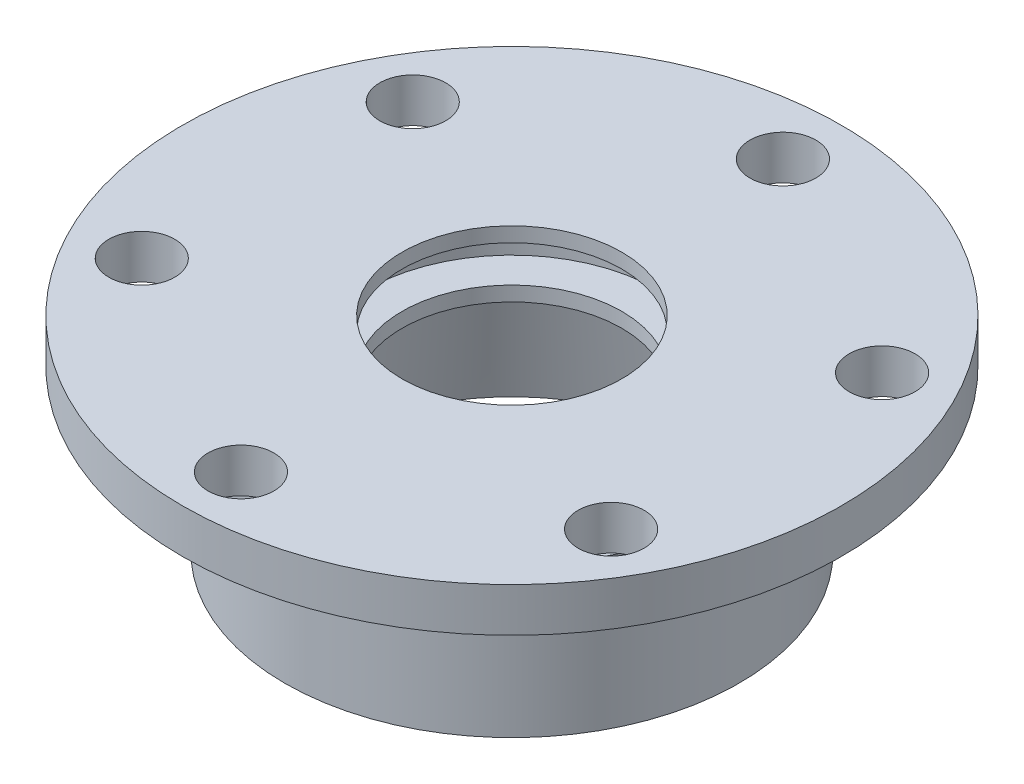
ISO-10303-21;
HEADER;
FILE_DESCRIPTION(('STEP AP214'),'2;1');
FILE_NAME('part.step','',(''),(''),'','','');
FILE_SCHEMA(('AUTOMOTIVE_DESIGN { 1 0 10303 214 1 1 1 1 }'));
ENDSEC;
DATA;
#1=APPLICATION_CONTEXT('core data for automotive mechanical design processes');
#2=APPLICATION_PROTOCOL_DEFINITION('international standard','automotive_design',2000,#1);
#3=PRODUCT_CONTEXT('',#1,'mechanical');
#4=PRODUCT('Part','Part','',(#3));
#5=PRODUCT_RELATED_PRODUCT_CATEGORY('part','',(#4));
#6=PRODUCT_DEFINITION_FORMATION('','',#4);
#7=PRODUCT_DEFINITION_CONTEXT('part definition',#1,'design');
#8=PRODUCT_DEFINITION('design','',#6,#7);
#9=PRODUCT_DEFINITION_SHAPE('','',#8);
#10=(LENGTH_UNIT() NAMED_UNIT(*) SI_UNIT(.MILLI.,.METRE.));
#11=(NAMED_UNIT(*) PLANE_ANGLE_UNIT() SI_UNIT($,.RADIAN.));
#12=(NAMED_UNIT(*) SI_UNIT($,.STERADIAN.) SOLID_ANGLE_UNIT());
#13=UNCERTAINTY_MEASURE_WITH_UNIT(LENGTH_MEASURE(1.E-05),#10,'distance_accuracy_value','');
#14=(GEOMETRIC_REPRESENTATION_CONTEXT(3) GLOBAL_UNCERTAINTY_ASSIGNED_CONTEXT((#13)) GLOBAL_UNIT_ASSIGNED_CONTEXT((#10,
#11,#12)) REPRESENTATION_CONTEXT('',''));
#15=CARTESIAN_POINT('',(0.,0.,0.));
#16=DIRECTION('',(0.,0.,1.));
#17=DIRECTION('',(1.,0.,0.));
#18=AXIS2_PLACEMENT_3D('',#15,#16,#17);
#19=CARTESIAN_POINT('',(-29.,28.,0.));
#20=DIRECTION('',(0.,1.,0.));
#21=DIRECTION('',(0.,0.,1.));
#22=AXIS2_PLACEMENT_3D('',#19,#20,#21);
#23=PLANE('',#22);
#24=CARTESIAN_POINT('',(0.,28.,-37.));
#25=DIRECTION('',(0.,1.,0.));
#26=DIRECTION('',(0.,0.,1.));
#27=AXIS2_PLACEMENT_3D('',#24,#25,#26);
#28=CIRCLE('',#27,4.5);
#29=CARTESIAN_POINT('',(0.,28.,-32.5));
#30=VERTEX_POINT('',#29);
#31=EDGE_CURVE('E79',#30,#30,#28,.T.);
#32=ORIENTED_EDGE('',*,*,#31,.F.);
#33=EDGE_LOOP('',(#32));
#34=FACE_BOUND('',#33,.T.);
#35=CARTESIAN_POINT('',(-32.0429399400232,28.,-18.4999999999982));
#36=DIRECTION('',(0.,1.,0.));
#37=DIRECTION('',(0.,0.,1.));
#38=AXIS2_PLACEMENT_3D('',#35,#36,#37);
#39=CIRCLE('',#38,4.50000000000197);
#40=CARTESIAN_POINT('',(-32.0429399400232,28.,-13.9999999999962));
#41=VERTEX_POINT('',#40);
#42=EDGE_CURVE('E84',#41,#41,#39,.T.);
#43=ORIENTED_EDGE('',*,*,#42,.F.);
#44=EDGE_LOOP('',(#43));
#45=FACE_BOUND('',#44,.T.);
#46=CARTESIAN_POINT('',(-32.0429399400211,28.,18.5000000000018));
#47=DIRECTION('',(0.,1.,0.));
#48=DIRECTION('',(0.,0.,1.));
#49=AXIS2_PLACEMENT_3D('',#46,#47,#48);
#50=CIRCLE('',#49,4.5000000000039);
#51=CARTESIAN_POINT('',(-32.0429399400211,28.,23.0000000000057));
#52=VERTEX_POINT('',#51);
#53=EDGE_CURVE('E83',#52,#52,#50,.T.);
#54=ORIENTED_EDGE('',*,*,#53,.F.);
#55=EDGE_LOOP('',(#54));
#56=FACE_BOUND('',#55,.T.);
#57=CARTESIAN_POINT('',(4.1990728836402E-12,28.,37.));
#58=DIRECTION('',(0.,1.,0.));
#59=DIRECTION('',(0.,0.,1.));
#60=AXIS2_PLACEMENT_3D('',#57,#58,#59);
#61=CIRCLE('',#60,4.50000000000426);
#62=CARTESIAN_POINT('',(4.1990728836402E-12,28.,41.5000000000043));
#63=VERTEX_POINT('',#62);
#64=EDGE_CURVE('E90',#63,#63,#61,.T.);
#65=ORIENTED_EDGE('',*,*,#64,.F.);
#66=EDGE_LOOP('',(#65));
#67=FACE_BOUND('',#66,.T.);
#68=CARTESIAN_POINT('',(32.0429399400274,28.,18.4999999999982));
#69=DIRECTION('',(0.,1.,0.));
#70=DIRECTION('',(0.,0.,1.));
#71=AXIS2_PLACEMENT_3D('',#68,#69,#70);
#72=CIRCLE('',#71,4.50000000000265);
#73=CARTESIAN_POINT('',(32.0429399400274,28.,23.0000000000008));
#74=VERTEX_POINT('',#73);
#75=EDGE_CURVE('E96',#74,#74,#72,.T.);
#76=ORIENTED_EDGE('',*,*,#75,.F.);
#77=EDGE_LOOP('',(#76));
#78=FACE_BOUND('',#77,.T.);
#79=CARTESIAN_POINT('',(32.0429399400253,28.,-18.5000000000018));
#80=DIRECTION('',(0.,1.,0.));
#81=DIRECTION('',(0.,0.,1.));
#82=AXIS2_PLACEMENT_3D('',#79,#80,#81);
#83=CIRCLE('',#82,4.50000000000057);
#84=CARTESIAN_POINT('',(32.0429399400253,28.,-14.0000000000013));
#85=VERTEX_POINT('',#84);
#86=EDGE_CURVE('E102',#85,#85,#83,.T.);
#87=ORIENTED_EDGE('',*,*,#86,.F.);
#88=EDGE_LOOP('',(#87));
#89=FACE_BOUND('',#88,.T.);
#90=CARTESIAN_POINT('',(0.,28.,0.));
#91=DIRECTION('',(0.,1.,0.));
#92=DIRECTION('',(0.,0.,1.));
#93=AXIS2_PLACEMENT_3D('',#90,#91,#92);
#94=CIRCLE('',#93,45.);
#95=CARTESIAN_POINT('',(0.,28.,45.));
#96=VERTEX_POINT('',#95);
#97=EDGE_CURVE('E76',#96,#96,#94,.T.);
#98=ORIENTED_EDGE('',*,*,#97,.T.);
#99=EDGE_LOOP('',(#98));
#100=FACE_BOUND('',#99,.T.);
#101=CARTESIAN_POINT('',(0.,28.,0.));
#102=DIRECTION('',(0.,1.,0.));
#103=DIRECTION('',(0.,0.,1.));
#104=AXIS2_PLACEMENT_3D('',#101,#102,#103);
#105=CIRCLE('',#104,15.);
#106=CARTESIAN_POINT('',(0.,28.,15.));
#107=VERTEX_POINT('',#106);
#108=EDGE_CURVE('E10',#107,#107,#105,.T.);
#109=ORIENTED_EDGE('',*,*,#108,.F.);
#110=EDGE_LOOP('',(#109));
#111=FACE_BOUND('',#110,.T.);
#112=ADVANCED_FACE('F30',(#34,#45,#56,#67,#78,#89,#100,#111),#23,.T.);
#113=CARTESIAN_POINT('',(0.,30.6187975640425,0.));
#114=DIRECTION('',(0.,1.,0.));
#115=DIRECTION('',(0.,0.,1.));
#116=AXIS2_PLACEMENT_3D('',#113,#114,#115);
#117=CYLINDRICAL_SURFACE('',#116,15.);
#118=ORIENTED_EDGE('',*,*,#108,.T.);
#119=EDGE_LOOP('',(#118));
#120=FACE_BOUND('',#119,.T.);
#121=CARTESIAN_POINT('',(0.,26.,0.));
#122=DIRECTION('',(0.,1.,0.));
#123=DIRECTION('',(0.,0.,1.));
#124=AXIS2_PLACEMENT_3D('',#121,#122,#123);
#125=CIRCLE('',#124,15.);
#126=CARTESIAN_POINT('',(0.,26.,15.));
#127=VERTEX_POINT('',#126);
#128=EDGE_CURVE('E36',#127,#127,#125,.T.);
#129=ORIENTED_EDGE('',*,*,#128,.F.);
#130=EDGE_LOOP('',(#129));
#131=FACE_BOUND('',#130,.T.);
#132=ADVANCED_FACE('F120',(#120,#131),#117,.F.);
#133=CARTESIAN_POINT('',(-15.,26.,0.));
#134=DIRECTION('',(0.,-1.,0.));
#135=DIRECTION('',(0.,0.,-1.));
#136=AXIS2_PLACEMENT_3D('',#133,#134,#135);
#137=PLANE('',#136);
#138=ORIENTED_EDGE('',*,*,#128,.T.);
#139=EDGE_LOOP('',(#138));
#140=FACE_BOUND('',#139,.T.);
#141=CARTESIAN_POINT('',(0.,26.,0.));
#142=DIRECTION('',(0.,1.,0.));
#143=DIRECTION('',(0.,0.,1.));
#144=AXIS2_PLACEMENT_3D('',#141,#142,#143);
#145=CIRCLE('',#144,20.);
#146=CARTESIAN_POINT('',(0.,26.,20.));
#147=VERTEX_POINT('',#146);
#148=EDGE_CURVE('E40',#147,#147,#145,.T.);
#149=ORIENTED_EDGE('',*,*,#148,.F.);
#150=EDGE_LOOP('',(#149));
#151=FACE_BOUND('',#150,.T.);
#152=ADVANCED_FACE('F188',(#140,#151),#137,.T.);
#153=CARTESIAN_POINT('',(0.,30.6187975640425,0.));
#154=DIRECTION('',(0.,1.,0.));
#155=DIRECTION('',(0.,0.,1.));
#156=AXIS2_PLACEMENT_3D('',#153,#154,#155);
#157=CYLINDRICAL_SURFACE('',#156,20.);
#158=ORIENTED_EDGE('',*,*,#148,.T.);
#159=EDGE_LOOP('',(#158));
#160=FACE_BOUND('',#159,.T.);
#161=CARTESIAN_POINT('',(0.,21.,0.));
#162=DIRECTION('',(0.,1.,0.));
#163=DIRECTION('',(0.,0.,1.));
#164=AXIS2_PLACEMENT_3D('',#161,#162,#163);
#165=CIRCLE('',#164,20.);
#166=CARTESIAN_POINT('',(0.,21.,20.));
#167=VERTEX_POINT('',#166);
#168=EDGE_CURVE('E44',#167,#167,#165,.T.);
#169=ORIENTED_EDGE('',*,*,#168,.F.);
#170=EDGE_LOOP('',(#169));
#171=FACE_BOUND('',#170,.T.);
#172=ADVANCED_FACE('F184',(#160,#171),#157,.F.);
#173=CARTESIAN_POINT('',(-20.,21.,0.));
#174=DIRECTION('',(0.,1.,0.));
#175=DIRECTION('',(0.,0.,1.));
#176=AXIS2_PLACEMENT_3D('',#173,#174,#175);
#177=PLANE('',#176);
#178=ORIENTED_EDGE('',*,*,#168,.T.);
#179=EDGE_LOOP('',(#178));
#180=FACE_BOUND('',#179,.T.);
#181=CARTESIAN_POINT('',(0.,21.,0.));
#182=DIRECTION('',(0.,1.,0.));
#183=DIRECTION('',(0.,0.,1.));
#184=AXIS2_PLACEMENT_3D('',#181,#182,#183);
#185=CIRCLE('',#184,15.);
#186=CARTESIAN_POINT('',(0.,21.,15.));
#187=VERTEX_POINT('',#186);
#188=EDGE_CURVE('E49',#187,#187,#185,.T.);
#189=ORIENTED_EDGE('',*,*,#188,.F.);
#190=EDGE_LOOP('',(#189));
#191=FACE_BOUND('',#190,.T.);
#192=ADVANCED_FACE('F180',(#180,#191),#177,.T.);
#193=CARTESIAN_POINT('',(0.,30.6187975640425,0.));
#194=DIRECTION('',(0.,1.,0.));
#195=DIRECTION('',(0.,0.,1.));
#196=AXIS2_PLACEMENT_3D('',#193,#194,#195);
#197=CYLINDRICAL_SURFACE('',#196,15.);
#198=ORIENTED_EDGE('',*,*,#188,.T.);
#199=EDGE_LOOP('',(#198));
#200=FACE_BOUND('',#199,.T.);
#201=CARTESIAN_POINT('',(0.,19.,0.));
#202=DIRECTION('',(0.,1.,0.));
#203=DIRECTION('',(0.,0.,1.));
#204=AXIS2_PLACEMENT_3D('',#201,#202,#203);
#205=CIRCLE('',#204,15.);
#206=CARTESIAN_POINT('',(0.,19.,15.));
#207=VERTEX_POINT('',#206);
#208=EDGE_CURVE('E52',#207,#207,#205,.T.);
#209=ORIENTED_EDGE('',*,*,#208,.F.);
#210=EDGE_LOOP('',(#209));
#211=FACE_BOUND('',#210,.T.);
#212=ADVANCED_FACE('F176',(#200,#211),#197,.F.);
#213=CARTESIAN_POINT('',(-15.,19.,0.));
#214=DIRECTION('',(0.,-1.,0.));
#215=DIRECTION('',(0.,0.,-1.));
#216=AXIS2_PLACEMENT_3D('',#213,#214,#215);
#217=PLANE('',#216);
#218=ORIENTED_EDGE('',*,*,#208,.T.);
#219=EDGE_LOOP('',(#218));
#220=FACE_BOUND('',#219,.T.);
#221=CARTESIAN_POINT('',(0.,19.,0.));
#222=DIRECTION('',(0.,1.,0.));
#223=DIRECTION('',(0.,0.,1.));
#224=AXIS2_PLACEMENT_3D('',#221,#222,#223);
#225=CIRCLE('',#224,22.6497873665392);
#226=CARTESIAN_POINT('',(0.,19.,22.6497873665392));
#227=VERTEX_POINT('',#226);
#228=EDGE_CURVE('E55',#227,#227,#225,.T.);
#229=ORIENTED_EDGE('',*,*,#228,.F.);
#230=EDGE_LOOP('',(#229));
#231=FACE_BOUND('',#230,.T.);
#232=ADVANCED_FACE('F172',(#220,#231),#217,.T.);
#233=CARTESIAN_POINT('',(0.,0.,0.));
#234=DIRECTION('',(0.,-1.,0.));
#235=DIRECTION('',(0.,0.,-1.));
#236=AXIS2_PLACEMENT_3D('',#233,#234,#235);
#237=CONICAL_SURFACE('',#236,26.,0.174532925199429);
#238=ORIENTED_EDGE('',*,*,#228,.T.);
#239=EDGE_LOOP('',(#238));
#240=FACE_BOUND('',#239,.T.);
#241=CARTESIAN_POINT('',(0.,0.,0.));
#242=DIRECTION('',(0.,1.,0.));
#243=DIRECTION('',(0.,0.,1.));
#244=AXIS2_PLACEMENT_3D('',#241,#242,#243);
#245=CIRCLE('',#244,26.);
#246=CARTESIAN_POINT('',(0.,0.,26.));
#247=VERTEX_POINT('',#246);
#248=EDGE_CURVE('E58',#247,#247,#245,.T.);
#249=ORIENTED_EDGE('',*,*,#248,.F.);
#250=EDGE_LOOP('',(#249));
#251=FACE_BOUND('',#250,.T.);
#252=ADVANCED_FACE('F168',(#240,#251),#237,.F.);
#253=CARTESIAN_POINT('',(-31.,0.,0.));
#254=DIRECTION('',(0.,-1.,0.));
#255=DIRECTION('',(0.,0.,-1.));
#256=AXIS2_PLACEMENT_3D('',#253,#254,#255);
#257=PLANE('',#256);
#258=ORIENTED_EDGE('',*,*,#248,.T.);
#259=EDGE_LOOP('',(#258));
#260=FACE_BOUND('',#259,.T.);
#261=CARTESIAN_POINT('',(0.,0.,0.));
#262=DIRECTION('',(0.,1.,0.));
#263=DIRECTION('',(0.,0.,1.));
#264=AXIS2_PLACEMENT_3D('',#261,#262,#263);
#265=CIRCLE('',#264,31.);
#266=CARTESIAN_POINT('',(0.,0.,31.));
#267=VERTEX_POINT('',#266);
#268=EDGE_CURVE('E61',#267,#267,#265,.T.);
#269=ORIENTED_EDGE('',*,*,#268,.F.);
#270=EDGE_LOOP('',(#269));
#271=FACE_BOUND('',#270,.T.);
#272=ADVANCED_FACE('F164',(#260,#271),#257,.T.);
#273=CARTESIAN_POINT('',(0.,30.6187975640425,0.));
#274=DIRECTION('',(0.,1.,0.));
#275=DIRECTION('',(0.,0.,1.));
#276=AXIS2_PLACEMENT_3D('',#273,#274,#275);
#277=CYLINDRICAL_SURFACE('',#276,31.);
#278=ORIENTED_EDGE('',*,*,#268,.T.);
#279=EDGE_LOOP('',(#278));
#280=FACE_BOUND('',#279,.T.);
#281=CARTESIAN_POINT('',(0.,20.5,0.));
#282=DIRECTION('',(0.,1.,0.));
#283=DIRECTION('',(0.,0.,1.));
#284=AXIS2_PLACEMENT_3D('',#281,#282,#283);
#285=CIRCLE('',#284,31.);
#286=CARTESIAN_POINT('',(0.,20.5,31.));
#287=VERTEX_POINT('',#286);
#288=EDGE_CURVE('E64',#287,#287,#285,.T.);
#289=ORIENTED_EDGE('',*,*,#288,.F.);
#290=EDGE_LOOP('',(#289));
#291=FACE_BOUND('',#290,.T.);
#292=ADVANCED_FACE('F160',(#280,#291),#277,.T.);
#293=CARTESIAN_POINT('',(-29.5,20.5,0.));
#294=DIRECTION('',(0.,1.,0.));
#295=DIRECTION('',(0.,0.,1.));
#296=AXIS2_PLACEMENT_3D('',#293,#294,#295);
#297=PLANE('',#296);
#298=ORIENTED_EDGE('',*,*,#288,.T.);
#299=EDGE_LOOP('',(#298));
#300=FACE_BOUND('',#299,.T.);
#301=CARTESIAN_POINT('',(0.,20.5,0.));
#302=DIRECTION('',(0.,1.,0.));
#303=DIRECTION('',(0.,0.,1.));
#304=AXIS2_PLACEMENT_3D('',#301,#302,#303);
#305=CIRCLE('',#304,29.5);
#306=CARTESIAN_POINT('',(0.,20.5,29.5));
#307=VERTEX_POINT('',#306);
#308=EDGE_CURVE('E67',#307,#307,#305,.T.);
#309=ORIENTED_EDGE('',*,*,#308,.F.);
#310=EDGE_LOOP('',(#309));
#311=FACE_BOUND('',#310,.T.);
#312=ADVANCED_FACE('F156',(#300,#311),#297,.T.);
#313=CARTESIAN_POINT('',(0.,30.6187975640425,0.));
#314=DIRECTION('',(0.,1.,0.));
#315=DIRECTION('',(0.,0.,1.));
#316=AXIS2_PLACEMENT_3D('',#313,#314,#315);
#317=CYLINDRICAL_SURFACE('',#316,29.5);
#318=ORIENTED_EDGE('',*,*,#308,.T.);
#319=EDGE_LOOP('',(#318));
#320=FACE_BOUND('',#319,.T.);
#321=CARTESIAN_POINT('',(0.,22.,0.));
#322=DIRECTION('',(0.,1.,0.));
#323=DIRECTION('',(0.,0.,1.));
#324=AXIS2_PLACEMENT_3D('',#321,#322,#323);
#325=CIRCLE('',#324,29.5);
#326=CARTESIAN_POINT('',(0.,22.,29.5));
#327=VERTEX_POINT('',#326);
#328=EDGE_CURVE('E70',#327,#327,#325,.T.);
#329=ORIENTED_EDGE('',*,*,#328,.F.);
#330=EDGE_LOOP('',(#329));
#331=FACE_BOUND('',#330,.T.);
#332=ADVANCED_FACE('F147',(#320,#331),#317,.T.);
#333=CARTESIAN_POINT('',(-45.,22.,0.));
#334=DIRECTION('',(0.,-1.,0.));
#335=DIRECTION('',(0.,0.,-1.));
#336=AXIS2_PLACEMENT_3D('',#333,#334,#335);
#337=PLANE('',#336);
#338=CARTESIAN_POINT('',(0.,22.,-37.));
#339=DIRECTION('',(0.,-1.,0.));
#340=DIRECTION('',(0.,0.,-1.));
#341=AXIS2_PLACEMENT_3D('',#338,#339,#340);
#342=CIRCLE('',#341,4.5);
#343=CARTESIAN_POINT('',(0.,22.,-32.5));
#344=VERTEX_POINT('',#343);
#345=EDGE_CURVE('E105',#344,#344,#342,.F.);
#346=ORIENTED_EDGE('',*,*,#345,.T.);
#347=EDGE_LOOP('',(#346));
#348=FACE_BOUND('',#347,.T.);
#349=CARTESIAN_POINT('',(-32.0429399400232,22.,-18.4999999999982));
#350=DIRECTION('',(0.,-1.,0.));
#351=DIRECTION('',(0.,0.,-1.));
#352=AXIS2_PLACEMENT_3D('',#349,#350,#351);
#353=CIRCLE('',#352,4.50000000000197);
#354=CARTESIAN_POINT('',(-32.0429399400232,22.,-13.9999999999962));
#355=VERTEX_POINT('',#354);
#356=EDGE_CURVE('E106',#355,#355,#353,.F.);
#357=ORIENTED_EDGE('',*,*,#356,.T.);
#358=EDGE_LOOP('',(#357));
#359=FACE_BOUND('',#358,.T.);
#360=CARTESIAN_POINT('',(-32.0429399400211,22.,18.5000000000018));
#361=DIRECTION('',(0.,-1.,0.));
#362=DIRECTION('',(0.,0.,-1.));
#363=AXIS2_PLACEMENT_3D('',#360,#361,#362);
#364=CIRCLE('',#363,4.5000000000039);
#365=CARTESIAN_POINT('',(-32.0429399400211,22.,23.0000000000057));
#366=VERTEX_POINT('',#365);
#367=EDGE_CURVE('E80',#366,#366,#364,.F.);
#368=ORIENTED_EDGE('',*,*,#367,.T.);
#369=EDGE_LOOP('',(#368));
#370=FACE_BOUND('',#369,.T.);
#371=CARTESIAN_POINT('',(4.1990728836402E-12,22.,37.));
#372=DIRECTION('',(0.,-1.,0.));
#373=DIRECTION('',(0.,0.,-1.));
#374=AXIS2_PLACEMENT_3D('',#371,#372,#373);
#375=CIRCLE('',#374,4.50000000000426);
#376=CARTESIAN_POINT('',(4.1990728836402E-12,22.,41.5000000000043));
#377=VERTEX_POINT('',#376);
#378=EDGE_CURVE('E87',#377,#377,#375,.F.);
#379=ORIENTED_EDGE('',*,*,#378,.T.);
#380=EDGE_LOOP('',(#379));
#381=FACE_BOUND('',#380,.T.);
#382=CARTESIAN_POINT('',(32.0429399400274,22.,18.4999999999982));
#383=DIRECTION('',(0.,-1.,0.));
#384=DIRECTION('',(0.,0.,-1.));
#385=AXIS2_PLACEMENT_3D('',#382,#383,#384);
#386=CIRCLE('',#385,4.50000000000265);
#387=CARTESIAN_POINT('',(32.0429399400274,22.,23.0000000000008));
#388=VERTEX_POINT('',#387);
#389=EDGE_CURVE('E93',#388,#388,#386,.F.);
#390=ORIENTED_EDGE('',*,*,#389,.T.);
#391=EDGE_LOOP('',(#390));
#392=FACE_BOUND('',#391,.T.);
#393=CARTESIAN_POINT('',(32.0429399400253,22.,-18.5000000000018));
#394=DIRECTION('',(0.,-1.,0.));
#395=DIRECTION('',(0.,0.,-1.));
#396=AXIS2_PLACEMENT_3D('',#393,#394,#395);
#397=CIRCLE('',#396,4.50000000000057);
#398=CARTESIAN_POINT('',(32.0429399400253,22.,-14.0000000000013));
#399=VERTEX_POINT('',#398);
#400=EDGE_CURVE('E99',#399,#399,#397,.F.);
#401=ORIENTED_EDGE('',*,*,#400,.T.);
#402=EDGE_LOOP('',(#401));
#403=FACE_BOUND('',#402,.T.);
#404=ORIENTED_EDGE('',*,*,#328,.T.);
#405=EDGE_LOOP('',(#404));
#406=FACE_BOUND('',#405,.T.);
#407=CARTESIAN_POINT('',(0.,22.,0.));
#408=DIRECTION('',(0.,1.,0.));
#409=DIRECTION('',(0.,0.,1.));
#410=AXIS2_PLACEMENT_3D('',#407,#408,#409);
#411=CIRCLE('',#410,45.);
#412=CARTESIAN_POINT('',(0.,22.,45.));
#413=VERTEX_POINT('',#412);
#414=EDGE_CURVE('E73',#413,#413,#411,.T.);
#415=ORIENTED_EDGE('',*,*,#414,.F.);
#416=EDGE_LOOP('',(#415));
#417=FACE_BOUND('',#416,.T.);
#418=ADVANCED_FACE('F137',(#348,#359,#370,#381,#392,#403,#406,#417),#337,.T.);
#419=CARTESIAN_POINT('',(0.,30.6187975640425,0.));
#420=DIRECTION('',(0.,1.,0.));
#421=DIRECTION('',(0.,0.,1.));
#422=AXIS2_PLACEMENT_3D('',#419,#420,#421);
#423=CYLINDRICAL_SURFACE('',#422,45.);
#424=ORIENTED_EDGE('',*,*,#414,.T.);
#425=EDGE_LOOP('',(#424));
#426=FACE_BOUND('',#425,.T.);
#427=ORIENTED_EDGE('',*,*,#97,.F.);
#428=EDGE_LOOP('',(#427));
#429=FACE_BOUND('',#428,.T.);
#430=ADVANCED_FACE('F134',(#426,#429),#423,.T.);
#431=CARTESIAN_POINT('',(32.0429399400253,-0.001000000000001,-18.5000000000018));
#432=DIRECTION('',(0.,1.,0.));
#433=DIRECTION('',(0.,0.,1.));
#434=AXIS2_PLACEMENT_3D('',#431,#432,#433);
#435=CYLINDRICAL_SURFACE('',#434,4.50000000000057);
#436=CARTESIAN_POINT('',(32.0429399400253,22.,-14.0000000000013));
#437=CARTESIAN_POINT('',(32.0429399400253,22.0625,-14.0000000000013));
#438=CARTESIAN_POINT('',(32.0429399400253,22.125,-14.0000000000013));
#439=CARTESIAN_POINT('',(32.0429399400253,22.25,-14.0000000000013));
#440=CARTESIAN_POINT('',(32.0429399400253,22.3125,-14.0000000000013));
#441=CARTESIAN_POINT('',(32.0429399400253,22.4375,-14.0000000000013));
#442=CARTESIAN_POINT('',(32.0429399400253,22.5,-14.0000000000013));
#443=CARTESIAN_POINT('',(32.0429399400253,22.625,-14.0000000000013));
#444=CARTESIAN_POINT('',(32.0429399400253,22.6875,-14.0000000000013));
#445=CARTESIAN_POINT('',(32.0429399400253,22.8125,-14.0000000000013));
#446=CARTESIAN_POINT('',(32.0429399400253,22.875,-14.0000000000013));
#447=CARTESIAN_POINT('',(32.0429399400253,23.,-14.0000000000013));
#448=CARTESIAN_POINT('',(32.0429399400253,23.0625,-14.0000000000013));
#449=CARTESIAN_POINT('',(32.0429399400253,23.1875,-14.0000000000013));
#450=CARTESIAN_POINT('',(32.0429399400253,23.25,-14.0000000000013));
#451=CARTESIAN_POINT('',(32.0429399400253,23.375,-14.0000000000013));
#452=CARTESIAN_POINT('',(32.0429399400253,23.4375,-14.0000000000013));
#453=CARTESIAN_POINT('',(32.0429399400253,23.5625,-14.0000000000013));
#454=CARTESIAN_POINT('',(32.0429399400253,23.625,-14.0000000000013));
#455=CARTESIAN_POINT('',(32.0429399400253,23.75,-14.0000000000013));
#456=CARTESIAN_POINT('',(32.0429399400253,23.8125,-14.0000000000013));
#457=CARTESIAN_POINT('',(32.0429399400253,23.9375,-14.0000000000013));
#458=CARTESIAN_POINT('',(32.0429399400253,24.,-14.0000000000013));
#459=CARTESIAN_POINT('',(32.0429399400253,24.125,-14.0000000000013));
#460=CARTESIAN_POINT('',(32.0429399400253,24.1875,-14.0000000000013));
#461=CARTESIAN_POINT('',(32.0429399400253,24.3125,-14.0000000000013));
#462=CARTESIAN_POINT('',(32.0429399400253,24.375,-14.0000000000013));
#463=CARTESIAN_POINT('',(32.0429399400253,24.5,-14.0000000000013));
#464=CARTESIAN_POINT('',(32.0429399400253,24.5625,-14.0000000000013));
#465=CARTESIAN_POINT('',(32.0429399400253,24.6875,-14.0000000000013));
#466=CARTESIAN_POINT('',(32.0429399400253,24.75,-14.0000000000013));
#467=CARTESIAN_POINT('',(32.0429399400253,24.875,-14.0000000000013));
#468=CARTESIAN_POINT('',(32.0429399400253,24.9375,-14.0000000000013));
#469=CARTESIAN_POINT('',(32.0429399400253,25.0625,-14.0000000000013));
#470=CARTESIAN_POINT('',(32.0429399400253,25.125,-14.0000000000013));
#471=CARTESIAN_POINT('',(32.0429399400253,25.25,-14.0000000000013));
#472=CARTESIAN_POINT('',(32.0429399400253,25.3125,-14.0000000000013));
#473=CARTESIAN_POINT('',(32.0429399400253,25.4375,-14.0000000000013));
#474=CARTESIAN_POINT('',(32.0429399400253,25.5,-14.0000000000013));
#475=CARTESIAN_POINT('',(32.0429399400253,25.625,-14.0000000000013));
#476=CARTESIAN_POINT('',(32.0429399400253,25.6875,-14.0000000000013));
#477=CARTESIAN_POINT('',(32.0429399400253,25.8125,-14.0000000000013));
#478=CARTESIAN_POINT('',(32.0429399400253,25.875,-14.0000000000013));
#479=CARTESIAN_POINT('',(32.0429399400253,26.,-14.0000000000013));
#480=CARTESIAN_POINT('',(32.0429399400253,26.0625,-14.0000000000013));
#481=CARTESIAN_POINT('',(32.0429399400253,26.1875,-14.0000000000013));
#482=CARTESIAN_POINT('',(32.0429399400253,26.25,-14.0000000000013));
#483=CARTESIAN_POINT('',(32.0429399400253,26.375,-14.0000000000013));
#484=CARTESIAN_POINT('',(32.0429399400253,26.4375,-14.0000000000013));
#485=CARTESIAN_POINT('',(32.0429399400253,26.5625,-14.0000000000013));
#486=CARTESIAN_POINT('',(32.0429399400253,26.625,-14.0000000000013));
#487=CARTESIAN_POINT('',(32.0429399400253,26.75,-14.0000000000013));
#488=CARTESIAN_POINT('',(32.0429399400253,26.8125,-14.0000000000013));
#489=CARTESIAN_POINT('',(32.0429399400253,26.9375,-14.0000000000013));
#490=CARTESIAN_POINT('',(32.0429399400253,27.,-14.0000000000013));
#491=CARTESIAN_POINT('',(32.0429399400253,27.125,-14.0000000000013));
#492=CARTESIAN_POINT('',(32.0429399400253,27.1875,-14.0000000000013));
#493=CARTESIAN_POINT('',(32.0429399400253,27.3125,-14.0000000000013));
#494=CARTESIAN_POINT('',(32.0429399400253,27.375,-14.0000000000013));
#495=CARTESIAN_POINT('',(32.0429399400253,27.5,-14.0000000000013));
#496=CARTESIAN_POINT('',(32.0429399400253,27.5625,-14.0000000000013));
#497=CARTESIAN_POINT('',(32.0429399400253,27.6875,-14.0000000000013));
#498=CARTESIAN_POINT('',(32.0429399400253,27.75,-14.0000000000013));
#499=CARTESIAN_POINT('',(32.0429399400253,27.875,-14.0000000000013));
#500=CARTESIAN_POINT('',(32.0429399400253,27.9375,-14.0000000000013));
#501=CARTESIAN_POINT('',(32.0429399400253,28.,-14.0000000000013));
#502=B_SPLINE_CURVE_WITH_KNOTS('',3,(#436,#437,#438,#439,#440,#441,#442,#443,#444,#445,#446,
#447,#448,#449,#450,#451,#452,#453,#454,#455,#456,#457,#458,#459,#460,#461,#462,#463,#464,#465,
#466,#467,#468,#469,#470,#471,#472,#473,#474,#475,#476,#477,#478,#479,#480,#481,#482,#483,#484,
#485,#486,#487,#488,#489,#490,#491,#492,#493,#494,#495,#496,#497,#498,#499,#500,#501),
.UNSPECIFIED.,.F.,.F.,(4,2,2,2,2,2,2,2,2,2,2,2,2,2,2,2,2,2,2,2,2,2,2,2,2,2,2,2,2,2,2,2,4),(0.,
0.1875,0.375,0.5625,0.750000000000001,0.937500000000001,1.125,1.3125,1.5,1.6875,1.875,2.0625,
2.25,2.4375,2.625,2.8125,3.,3.1875,3.375,3.5625,3.75,3.9375,4.125,4.3125,4.5,4.6875,4.875,
5.0625,5.25,5.4375,5.625,5.8125,6.),.UNSPECIFIED.);
#503=EDGE_CURVE('BSEAM136',#399,#85,#502,.T.);
#504=ORIENTED_EDGE('',*,*,#400,.F.);
#505=ORIENTED_EDGE('',*,*,#86,.T.);
#506=ORIENTED_EDGE('',*,*,#503,.T.);
#507=ORIENTED_EDGE('',*,*,#503,.F.);
#508=EDGE_LOOP('',(#504,#506,#505,#507));
#509=FACE_BOUND('',#508,.T.);
#510=ADVANCED_FACE('F136',(#509),#435,.F.);
#511=CARTESIAN_POINT('',(32.0429399400274,-0.001000000000001,18.4999999999982));
#512=DIRECTION('',(0.,1.,0.));
#513=DIRECTION('',(0.,0.,1.));
#514=AXIS2_PLACEMENT_3D('',#511,#512,#513);
#515=CYLINDRICAL_SURFACE('',#514,4.50000000000265);
#516=CARTESIAN_POINT('',(32.0429399400274,22.,23.0000000000008));
#517=CARTESIAN_POINT('',(32.0429399400274,22.0625,23.0000000000008));
#518=CARTESIAN_POINT('',(32.0429399400274,22.125,23.0000000000008));
#519=CARTESIAN_POINT('',(32.0429399400274,22.25,23.0000000000008));
#520=CARTESIAN_POINT('',(32.0429399400274,22.3125,23.0000000000008));
#521=CARTESIAN_POINT('',(32.0429399400274,22.4375,23.0000000000008));
#522=CARTESIAN_POINT('',(32.0429399400274,22.5,23.0000000000008));
#523=CARTESIAN_POINT('',(32.0429399400274,22.625,23.0000000000008));
#524=CARTESIAN_POINT('',(32.0429399400274,22.6875,23.0000000000008));
#525=CARTESIAN_POINT('',(32.0429399400274,22.8125,23.0000000000008));
#526=CARTESIAN_POINT('',(32.0429399400274,22.875,23.0000000000008));
#527=CARTESIAN_POINT('',(32.0429399400274,23.,23.0000000000008));
#528=CARTESIAN_POINT('',(32.0429399400274,23.0625,23.0000000000008));
#529=CARTESIAN_POINT('',(32.0429399400274,23.1875,23.0000000000008));
#530=CARTESIAN_POINT('',(32.0429399400274,23.25,23.0000000000008));
#531=CARTESIAN_POINT('',(32.0429399400274,23.375,23.0000000000008));
#532=CARTESIAN_POINT('',(32.0429399400274,23.4375,23.0000000000008));
#533=CARTESIAN_POINT('',(32.0429399400274,23.5625,23.0000000000008));
#534=CARTESIAN_POINT('',(32.0429399400274,23.625,23.0000000000008));
#535=CARTESIAN_POINT('',(32.0429399400274,23.75,23.0000000000008));
#536=CARTESIAN_POINT('',(32.0429399400274,23.8125,23.0000000000008));
#537=CARTESIAN_POINT('',(32.0429399400274,23.9375,23.0000000000008));
#538=CARTESIAN_POINT('',(32.0429399400274,24.,23.0000000000008));
#539=CARTESIAN_POINT('',(32.0429399400274,24.125,23.0000000000008));
#540=CARTESIAN_POINT('',(32.0429399400274,24.1875,23.0000000000008));
#541=CARTESIAN_POINT('',(32.0429399400274,24.3125,23.0000000000008));
#542=CARTESIAN_POINT('',(32.0429399400274,24.375,23.0000000000008));
#543=CARTESIAN_POINT('',(32.0429399400274,24.5,23.0000000000008));
#544=CARTESIAN_POINT('',(32.0429399400274,24.5625,23.0000000000008));
#545=CARTESIAN_POINT('',(32.0429399400274,24.6875,23.0000000000008));
#546=CARTESIAN_POINT('',(32.0429399400274,24.75,23.0000000000008));
#547=CARTESIAN_POINT('',(32.0429399400274,24.875,23.0000000000008));
#548=CARTESIAN_POINT('',(32.0429399400274,24.9375,23.0000000000008));
#549=CARTESIAN_POINT('',(32.0429399400274,25.0625,23.0000000000008));
#550=CARTESIAN_POINT('',(32.0429399400274,25.125,23.0000000000008));
#551=CARTESIAN_POINT('',(32.0429399400274,25.25,23.0000000000008));
#552=CARTESIAN_POINT('',(32.0429399400274,25.3125,23.0000000000008));
#553=CARTESIAN_POINT('',(32.0429399400274,25.4375,23.0000000000008));
#554=CARTESIAN_POINT('',(32.0429399400274,25.5,23.0000000000008));
#555=CARTESIAN_POINT('',(32.0429399400274,25.625,23.0000000000008));
#556=CARTESIAN_POINT('',(32.0429399400274,25.6875,23.0000000000008));
#557=CARTESIAN_POINT('',(32.0429399400274,25.8125,23.0000000000008));
#558=CARTESIAN_POINT('',(32.0429399400274,25.875,23.0000000000008));
#559=CARTESIAN_POINT('',(32.0429399400274,26.,23.0000000000008));
#560=CARTESIAN_POINT('',(32.0429399400274,26.0625,23.0000000000008));
#561=CARTESIAN_POINT('',(32.0429399400274,26.1875,23.0000000000008));
#562=CARTESIAN_POINT('',(32.0429399400274,26.25,23.0000000000008));
#563=CARTESIAN_POINT('',(32.0429399400274,26.375,23.0000000000008));
#564=CARTESIAN_POINT('',(32.0429399400274,26.4375,23.0000000000008));
#565=CARTESIAN_POINT('',(32.0429399400274,26.5625,23.0000000000008));
#566=CARTESIAN_POINT('',(32.0429399400274,26.625,23.0000000000008));
#567=CARTESIAN_POINT('',(32.0429399400274,26.75,23.0000000000008));
#568=CARTESIAN_POINT('',(32.0429399400274,26.8125,23.0000000000008));
#569=CARTESIAN_POINT('',(32.0429399400274,26.9375,23.0000000000008));
#570=CARTESIAN_POINT('',(32.0429399400274,27.,23.0000000000008));
#571=CARTESIAN_POINT('',(32.0429399400274,27.125,23.0000000000008));
#572=CARTESIAN_POINT('',(32.0429399400274,27.1875,23.0000000000008));
#573=CARTESIAN_POINT('',(32.0429399400274,27.3125,23.0000000000008));
#574=CARTESIAN_POINT('',(32.0429399400274,27.375,23.0000000000008));
#575=CARTESIAN_POINT('',(32.0429399400274,27.5,23.0000000000008));
#576=CARTESIAN_POINT('',(32.0429399400274,27.5625,23.0000000000008));
#577=CARTESIAN_POINT('',(32.0429399400274,27.6875,23.0000000000008));
#578=CARTESIAN_POINT('',(32.0429399400274,27.75,23.0000000000008));
#579=CARTESIAN_POINT('',(32.0429399400274,27.875,23.0000000000008));
#580=CARTESIAN_POINT('',(32.0429399400274,27.9375,23.0000000000008));
#581=CARTESIAN_POINT('',(32.0429399400274,28.,23.0000000000008));
#582=B_SPLINE_CURVE_WITH_KNOTS('',3,(#516,#517,#518,#519,#520,#521,#522,#523,#524,#525,#526,
#527,#528,#529,#530,#531,#532,#533,#534,#535,#536,#537,#538,#539,#540,#541,#542,#543,#544,#545,
#546,#547,#548,#549,#550,#551,#552,#553,#554,#555,#556,#557,#558,#559,#560,#561,#562,#563,#564,
#565,#566,#567,#568,#569,#570,#571,#572,#573,#574,#575,#576,#577,#578,#579,#580,#581),
.UNSPECIFIED.,.F.,.F.,(4,2,2,2,2,2,2,2,2,2,2,2,2,2,2,2,2,2,2,2,2,2,2,2,2,2,2,2,2,2,2,2,4),(0.,
0.1875,0.375,0.5625,0.750000000000001,0.937500000000001,1.125,1.3125,1.5,1.6875,1.875,2.0625,
2.25,2.4375,2.625,2.8125,3.,3.1875,3.375,3.5625,3.75,3.9375,4.125,4.3125,4.5,4.6875,4.875,
5.0625,5.25,5.4375,5.625,5.8125,6.),.UNSPECIFIED.);
#583=EDGE_CURVE('BSEAM144',#388,#74,#582,.T.);
#584=ORIENTED_EDGE('',*,*,#389,.F.);
#585=ORIENTED_EDGE('',*,*,#75,.T.);
#586=ORIENTED_EDGE('',*,*,#583,.T.);
#587=ORIENTED_EDGE('',*,*,#583,.F.);
#588=EDGE_LOOP('',(#584,#586,#585,#587));
#589=FACE_BOUND('',#588,.T.);
#590=ADVANCED_FACE('F144',(#589),#515,.F.);
#591=CARTESIAN_POINT('',(4.1990728836402E-12,-0.001000000000001,37.));
#592=DIRECTION('',(0.,1.,0.));
#593=DIRECTION('',(0.,0.,1.));
#594=AXIS2_PLACEMENT_3D('',#591,#592,#593);
#595=CYLINDRICAL_SURFACE('',#594,4.50000000000426);
#596=CARTESIAN_POINT('',(4.1990728836402E-12,22.,41.5000000000043));
#597=CARTESIAN_POINT('',(4.1990728836402E-12,22.0625,41.5000000000043));
#598=CARTESIAN_POINT('',(4.1990728836402E-12,22.125,41.5000000000043));
#599=CARTESIAN_POINT('',(4.1990728836402E-12,22.25,41.5000000000043));
#600=CARTESIAN_POINT('',(4.1990728836402E-12,22.3125,41.5000000000043));
#601=CARTESIAN_POINT('',(4.1990728836402E-12,22.4375,41.5000000000043));
#602=CARTESIAN_POINT('',(4.1990728836402E-12,22.5,41.5000000000043));
#603=CARTESIAN_POINT('',(4.1990728836402E-12,22.625,41.5000000000043));
#604=CARTESIAN_POINT('',(4.1990728836402E-12,22.6875,41.5000000000043));
#605=CARTESIAN_POINT('',(4.1990728836402E-12,22.8125,41.5000000000043));
#606=CARTESIAN_POINT('',(4.1990728836402E-12,22.875,41.5000000000043));
#607=CARTESIAN_POINT('',(4.1990728836402E-12,23.,41.5000000000043));
#608=CARTESIAN_POINT('',(4.1990728836402E-12,23.0625,41.5000000000043));
#609=CARTESIAN_POINT('',(4.1990728836402E-12,23.1875,41.5000000000043));
#610=CARTESIAN_POINT('',(4.1990728836402E-12,23.25,41.5000000000043));
#611=CARTESIAN_POINT('',(4.1990728836402E-12,23.375,41.5000000000043));
#612=CARTESIAN_POINT('',(4.1990728836402E-12,23.4375,41.5000000000043));
#613=CARTESIAN_POINT('',(4.1990728836402E-12,23.5625,41.5000000000043));
#614=CARTESIAN_POINT('',(4.1990728836402E-12,23.625,41.5000000000043));
#615=CARTESIAN_POINT('',(4.1990728836402E-12,23.75,41.5000000000043));
#616=CARTESIAN_POINT('',(4.1990728836402E-12,23.8125,41.5000000000043));
#617=CARTESIAN_POINT('',(4.1990728836402E-12,23.9375,41.5000000000043));
#618=CARTESIAN_POINT('',(4.1990728836402E-12,24.,41.5000000000043));
#619=CARTESIAN_POINT('',(4.1990728836402E-12,24.125,41.5000000000043));
#620=CARTESIAN_POINT('',(4.1990728836402E-12,24.1875,41.5000000000043));
#621=CARTESIAN_POINT('',(4.1990728836402E-12,24.3125,41.5000000000043));
#622=CARTESIAN_POINT('',(4.1990728836402E-12,24.375,41.5000000000043));
#623=CARTESIAN_POINT('',(4.1990728836402E-12,24.5,41.5000000000043));
#624=CARTESIAN_POINT('',(4.1990728836402E-12,24.5625,41.5000000000043));
#625=CARTESIAN_POINT('',(4.1990728836402E-12,24.6875,41.5000000000043));
#626=CARTESIAN_POINT('',(4.1990728836402E-12,24.75,41.5000000000043));
#627=CARTESIAN_POINT('',(4.1990728836402E-12,24.875,41.5000000000043));
#628=CARTESIAN_POINT('',(4.1990728836402E-12,24.9375,41.5000000000043));
#629=CARTESIAN_POINT('',(4.1990728836402E-12,25.0625,41.5000000000043));
#630=CARTESIAN_POINT('',(4.1990728836402E-12,25.125,41.5000000000043));
#631=CARTESIAN_POINT('',(4.1990728836402E-12,25.25,41.5000000000043));
#632=CARTESIAN_POINT('',(4.1990728836402E-12,25.3125,41.5000000000043));
#633=CARTESIAN_POINT('',(4.1990728836402E-12,25.4375,41.5000000000043));
#634=CARTESIAN_POINT('',(4.1990728836402E-12,25.5,41.5000000000043));
#635=CARTESIAN_POINT('',(4.1990728836402E-12,25.625,41.5000000000043));
#636=CARTESIAN_POINT('',(4.1990728836402E-12,25.6875,41.5000000000043));
#637=CARTESIAN_POINT('',(4.1990728836402E-12,25.8125,41.5000000000043));
#638=CARTESIAN_POINT('',(4.1990728836402E-12,25.875,41.5000000000043));
#639=CARTESIAN_POINT('',(4.1990728836402E-12,26.,41.5000000000043));
#640=CARTESIAN_POINT('',(4.1990728836402E-12,26.0625,41.5000000000043));
#641=CARTESIAN_POINT('',(4.1990728836402E-12,26.1875,41.5000000000043));
#642=CARTESIAN_POINT('',(4.1990728836402E-12,26.25,41.5000000000043));
#643=CARTESIAN_POINT('',(4.1990728836402E-12,26.375,41.5000000000043));
#644=CARTESIAN_POINT('',(4.1990728836402E-12,26.4375,41.5000000000043));
#645=CARTESIAN_POINT('',(4.1990728836402E-12,26.5625,41.5000000000043));
#646=CARTESIAN_POINT('',(4.1990728836402E-12,26.625,41.5000000000043));
#647=CARTESIAN_POINT('',(4.1990728836402E-12,26.75,41.5000000000043));
#648=CARTESIAN_POINT('',(4.1990728836402E-12,26.8125,41.5000000000043));
#649=CARTESIAN_POINT('',(4.1990728836402E-12,26.9375,41.5000000000043));
#650=CARTESIAN_POINT('',(4.1990728836402E-12,27.,41.5000000000043));
#651=CARTESIAN_POINT('',(4.1990728836402E-12,27.125,41.5000000000043));
#652=CARTESIAN_POINT('',(4.1990728836402E-12,27.1875,41.5000000000043));
#653=CARTESIAN_POINT('',(4.1990728836402E-12,27.3125,41.5000000000043));
#654=CARTESIAN_POINT('',(4.1990728836402E-12,27.375,41.5000000000043));
#655=CARTESIAN_POINT('',(4.1990728836402E-12,27.5,41.5000000000043));
#656=CARTESIAN_POINT('',(4.1990728836402E-12,27.5625,41.5000000000043));
#657=CARTESIAN_POINT('',(4.1990728836402E-12,27.6875,41.5000000000043));
#658=CARTESIAN_POINT('',(4.1990728836402E-12,27.75,41.5000000000043));
#659=CARTESIAN_POINT('',(4.1990728836402E-12,27.875,41.5000000000043));
#660=CARTESIAN_POINT('',(4.1990728836402E-12,27.9375,41.5000000000043));
#661=CARTESIAN_POINT('',(4.1990728836402E-12,28.,41.5000000000043));
#662=B_SPLINE_CURVE_WITH_KNOTS('',3,(#596,#597,#598,#599,#600,#601,#602,#603,#604,#605,#606,
#607,#608,#609,#610,#611,#612,#613,#614,#615,#616,#617,#618,#619,#620,#621,#622,#623,#624,#625,
#626,#627,#628,#629,#630,#631,#632,#633,#634,#635,#636,#637,#638,#639,#640,#641,#642,#643,#644,
#645,#646,#647,#648,#649,#650,#651,#652,#653,#654,#655,#656,#657,#658,#659,#660,#661),
.UNSPECIFIED.,.F.,.F.,(4,2,2,2,2,2,2,2,2,2,2,2,2,2,2,2,2,2,2,2,2,2,2,2,2,2,2,2,2,2,2,2,4),(0.,
0.1875,0.375,0.5625,0.750000000000001,0.937500000000001,1.125,1.3125,1.5,1.6875,1.875,2.0625,
2.25,2.4375,2.625,2.8125,3.,3.1875,3.375,3.5625,3.75,3.9375,4.125,4.3125,4.5,4.6875,4.875,
5.0625,5.25,5.4375,5.625,5.8125,6.),.UNSPECIFIED.);
#663=EDGE_CURVE('BSEAM259',#377,#63,#662,.T.);
#664=ORIENTED_EDGE('',*,*,#378,.F.);
#665=ORIENTED_EDGE('',*,*,#64,.T.);
#666=ORIENTED_EDGE('',*,*,#663,.T.);
#667=ORIENTED_EDGE('',*,*,#663,.F.);
#668=EDGE_LOOP('',(#664,#666,#665,#667));
#669=FACE_BOUND('',#668,.T.);
#670=ADVANCED_FACE('F259',(#669),#595,.F.);
#671=CARTESIAN_POINT('',(-32.0429399400211,-0.001000000000001,18.5000000000018));
#672=DIRECTION('',(0.,1.,0.));
#673=DIRECTION('',(0.,0.,1.));
#674=AXIS2_PLACEMENT_3D('',#671,#672,#673);
#675=CYLINDRICAL_SURFACE('',#674,4.5000000000039);
#676=CARTESIAN_POINT('',(-32.0429399400211,22.,23.0000000000057));
#677=CARTESIAN_POINT('',(-32.0429399400211,22.0625,23.0000000000057));
#678=CARTESIAN_POINT('',(-32.0429399400211,22.125,23.0000000000057));
#679=CARTESIAN_POINT('',(-32.0429399400211,22.25,23.0000000000057));
#680=CARTESIAN_POINT('',(-32.0429399400211,22.3125,23.0000000000057));
#681=CARTESIAN_POINT('',(-32.0429399400211,22.4375,23.0000000000057));
#682=CARTESIAN_POINT('',(-32.0429399400211,22.5,23.0000000000057));
#683=CARTESIAN_POINT('',(-32.0429399400211,22.625,23.0000000000057));
#684=CARTESIAN_POINT('',(-32.0429399400211,22.6875,23.0000000000057));
#685=CARTESIAN_POINT('',(-32.0429399400211,22.8125,23.0000000000057));
#686=CARTESIAN_POINT('',(-32.0429399400211,22.875,23.0000000000057));
#687=CARTESIAN_POINT('',(-32.0429399400211,23.,23.0000000000057));
#688=CARTESIAN_POINT('',(-32.0429399400211,23.0625,23.0000000000057));
#689=CARTESIAN_POINT('',(-32.0429399400211,23.1875,23.0000000000057));
#690=CARTESIAN_POINT('',(-32.0429399400211,23.25,23.0000000000057));
#691=CARTESIAN_POINT('',(-32.0429399400211,23.375,23.0000000000057));
#692=CARTESIAN_POINT('',(-32.0429399400211,23.4375,23.0000000000057));
#693=CARTESIAN_POINT('',(-32.0429399400211,23.5625,23.0000000000057));
#694=CARTESIAN_POINT('',(-32.0429399400211,23.625,23.0000000000057));
#695=CARTESIAN_POINT('',(-32.0429399400211,23.75,23.0000000000057));
#696=CARTESIAN_POINT('',(-32.0429399400211,23.8125,23.0000000000057));
#697=CARTESIAN_POINT('',(-32.0429399400211,23.9375,23.0000000000057));
#698=CARTESIAN_POINT('',(-32.0429399400211,24.,23.0000000000057));
#699=CARTESIAN_POINT('',(-32.0429399400211,24.125,23.0000000000057));
#700=CARTESIAN_POINT('',(-32.0429399400211,24.1875,23.0000000000057));
#701=CARTESIAN_POINT('',(-32.0429399400211,24.3125,23.0000000000057));
#702=CARTESIAN_POINT('',(-32.0429399400211,24.375,23.0000000000057));
#703=CARTESIAN_POINT('',(-32.0429399400211,24.5,23.0000000000057));
#704=CARTESIAN_POINT('',(-32.0429399400211,24.5625,23.0000000000057));
#705=CARTESIAN_POINT('',(-32.0429399400211,24.6875,23.0000000000057));
#706=CARTESIAN_POINT('',(-32.0429399400211,24.75,23.0000000000057));
#707=CARTESIAN_POINT('',(-32.0429399400211,24.875,23.0000000000057));
#708=CARTESIAN_POINT('',(-32.0429399400211,24.9375,23.0000000000057));
#709=CARTESIAN_POINT('',(-32.0429399400211,25.0625,23.0000000000057));
#710=CARTESIAN_POINT('',(-32.0429399400211,25.125,23.0000000000057));
#711=CARTESIAN_POINT('',(-32.0429399400211,25.25,23.0000000000057));
#712=CARTESIAN_POINT('',(-32.0429399400211,25.3125,23.0000000000057));
#713=CARTESIAN_POINT('',(-32.0429399400211,25.4375,23.0000000000057));
#714=CARTESIAN_POINT('',(-32.0429399400211,25.5,23.0000000000057));
#715=CARTESIAN_POINT('',(-32.0429399400211,25.625,23.0000000000057));
#716=CARTESIAN_POINT('',(-32.0429399400211,25.6875,23.0000000000057));
#717=CARTESIAN_POINT('',(-32.0429399400211,25.8125,23.0000000000057));
#718=CARTESIAN_POINT('',(-32.0429399400211,25.875,23.0000000000057));
#719=CARTESIAN_POINT('',(-32.0429399400211,26.,23.0000000000057));
#720=CARTESIAN_POINT('',(-32.0429399400211,26.0625,23.0000000000057));
#721=CARTESIAN_POINT('',(-32.0429399400211,26.1875,23.0000000000057));
#722=CARTESIAN_POINT('',(-32.0429399400211,26.25,23.0000000000057));
#723=CARTESIAN_POINT('',(-32.0429399400211,26.375,23.0000000000057));
#724=CARTESIAN_POINT('',(-32.0429399400211,26.4375,23.0000000000057));
#725=CARTESIAN_POINT('',(-32.0429399400211,26.5625,23.0000000000057));
#726=CARTESIAN_POINT('',(-32.0429399400211,26.625,23.0000000000057));
#727=CARTESIAN_POINT('',(-32.0429399400211,26.75,23.0000000000057));
#728=CARTESIAN_POINT('',(-32.0429399400211,26.8125,23.0000000000057));
#729=CARTESIAN_POINT('',(-32.0429399400211,26.9375,23.0000000000057));
#730=CARTESIAN_POINT('',(-32.0429399400211,27.,23.0000000000057));
#731=CARTESIAN_POINT('',(-32.0429399400211,27.125,23.0000000000057));
#732=CARTESIAN_POINT('',(-32.0429399400211,27.1875,23.0000000000057));
#733=CARTESIAN_POINT('',(-32.0429399400211,27.3125,23.0000000000057));
#734=CARTESIAN_POINT('',(-32.0429399400211,27.375,23.0000000000057));
#735=CARTESIAN_POINT('',(-32.0429399400211,27.5,23.0000000000057));
#736=CARTESIAN_POINT('',(-32.0429399400211,27.5625,23.0000000000057));
#737=CARTESIAN_POINT('',(-32.0429399400211,27.6875,23.0000000000057));
#738=CARTESIAN_POINT('',(-32.0429399400211,27.75,23.0000000000057));
#739=CARTESIAN_POINT('',(-32.0429399400211,27.875,23.0000000000057));
#740=CARTESIAN_POINT('',(-32.0429399400211,27.9375,23.0000000000057));
#741=CARTESIAN_POINT('',(-32.0429399400211,28.,23.0000000000057));
#742=B_SPLINE_CURVE_WITH_KNOTS('',3,(#676,#677,#678,#679,#680,#681,#682,#683,#684,#685,#686,
#687,#688,#689,#690,#691,#692,#693,#694,#695,#696,#697,#698,#699,#700,#701,#702,#703,#704,#705,
#706,#707,#708,#709,#710,#711,#712,#713,#714,#715,#716,#717,#718,#719,#720,#721,#722,#723,#724,
#725,#726,#727,#728,#729,#730,#731,#732,#733,#734,#735,#736,#737,#738,#739,#740,#741),
.UNSPECIFIED.,.F.,.F.,(4,2,2,2,2,2,2,2,2,2,2,2,2,2,2,2,2,2,2,2,2,2,2,2,2,2,2,2,2,2,2,2,4),(0.,
0.1875,0.375,0.5625,0.750000000000001,0.937500000000001,1.125,1.3125,1.5,1.6875,1.875,2.0625,
2.25,2.4375,2.625,2.8125,3.,3.1875,3.375,3.5625,3.75,3.9375,4.125,4.3125,4.5,4.6875,4.875,
5.0625,5.25,5.4375,5.625,5.8125,6.),.UNSPECIFIED.);
#743=EDGE_CURVE('BSEAM151',#366,#52,#742,.T.);
#744=ORIENTED_EDGE('',*,*,#367,.F.);
#745=ORIENTED_EDGE('',*,*,#53,.T.);
#746=ORIENTED_EDGE('',*,*,#743,.T.);
#747=ORIENTED_EDGE('',*,*,#743,.F.);
#748=EDGE_LOOP('',(#744,#746,#745,#747));
#749=FACE_BOUND('',#748,.T.);
#750=ADVANCED_FACE('F151',(#749),#675,.F.);
#751=CARTESIAN_POINT('',(-32.0429399400232,-0.001000000000001,-18.4999999999982));
#752=DIRECTION('',(0.,1.,0.));
#753=DIRECTION('',(0.,0.,1.));
#754=AXIS2_PLACEMENT_3D('',#751,#752,#753);
#755=CYLINDRICAL_SURFACE('',#754,4.50000000000197);
#756=CARTESIAN_POINT('',(-32.0429399400232,22.,-13.9999999999962));
#757=CARTESIAN_POINT('',(-32.0429399400232,22.0625,-13.9999999999962));
#758=CARTESIAN_POINT('',(-32.0429399400232,22.125,-13.9999999999962));
#759=CARTESIAN_POINT('',(-32.0429399400232,22.25,-13.9999999999962));
#760=CARTESIAN_POINT('',(-32.0429399400232,22.3125,-13.9999999999962));
#761=CARTESIAN_POINT('',(-32.0429399400232,22.4375,-13.9999999999962));
#762=CARTESIAN_POINT('',(-32.0429399400232,22.5,-13.9999999999962));
#763=CARTESIAN_POINT('',(-32.0429399400232,22.625,-13.9999999999962));
#764=CARTESIAN_POINT('',(-32.0429399400232,22.6875,-13.9999999999962));
#765=CARTESIAN_POINT('',(-32.0429399400232,22.8125,-13.9999999999962));
#766=CARTESIAN_POINT('',(-32.0429399400232,22.875,-13.9999999999962));
#767=CARTESIAN_POINT('',(-32.0429399400232,23.,-13.9999999999962));
#768=CARTESIAN_POINT('',(-32.0429399400232,23.0625,-13.9999999999962));
#769=CARTESIAN_POINT('',(-32.0429399400232,23.1875,-13.9999999999962));
#770=CARTESIAN_POINT('',(-32.0429399400232,23.25,-13.9999999999962));
#771=CARTESIAN_POINT('',(-32.0429399400232,23.375,-13.9999999999962));
#772=CARTESIAN_POINT('',(-32.0429399400232,23.4375,-13.9999999999962));
#773=CARTESIAN_POINT('',(-32.0429399400232,23.5625,-13.9999999999962));
#774=CARTESIAN_POINT('',(-32.0429399400232,23.625,-13.9999999999962));
#775=CARTESIAN_POINT('',(-32.0429399400232,23.75,-13.9999999999962));
#776=CARTESIAN_POINT('',(-32.0429399400232,23.8125,-13.9999999999962));
#777=CARTESIAN_POINT('',(-32.0429399400232,23.9375,-13.9999999999962));
#778=CARTESIAN_POINT('',(-32.0429399400232,24.,-13.9999999999962));
#779=CARTESIAN_POINT('',(-32.0429399400232,24.125,-13.9999999999962));
#780=CARTESIAN_POINT('',(-32.0429399400232,24.1875,-13.9999999999962));
#781=CARTESIAN_POINT('',(-32.0429399400232,24.3125,-13.9999999999962));
#782=CARTESIAN_POINT('',(-32.0429399400232,24.375,-13.9999999999962));
#783=CARTESIAN_POINT('',(-32.0429399400232,24.5,-13.9999999999962));
#784=CARTESIAN_POINT('',(-32.0429399400232,24.5625,-13.9999999999962));
#785=CARTESIAN_POINT('',(-32.0429399400232,24.6875,-13.9999999999962));
#786=CARTESIAN_POINT('',(-32.0429399400232,24.75,-13.9999999999962));
#787=CARTESIAN_POINT('',(-32.0429399400232,24.875,-13.9999999999962));
#788=CARTESIAN_POINT('',(-32.0429399400232,24.9375,-13.9999999999962));
#789=CARTESIAN_POINT('',(-32.0429399400232,25.0625,-13.9999999999962));
#790=CARTESIAN_POINT('',(-32.0429399400232,25.125,-13.9999999999962));
#791=CARTESIAN_POINT('',(-32.0429399400232,25.25,-13.9999999999962));
#792=CARTESIAN_POINT('',(-32.0429399400232,25.3125,-13.9999999999962));
#793=CARTESIAN_POINT('',(-32.0429399400232,25.4375,-13.9999999999962));
#794=CARTESIAN_POINT('',(-32.0429399400232,25.5,-13.9999999999962));
#795=CARTESIAN_POINT('',(-32.0429399400232,25.625,-13.9999999999962));
#796=CARTESIAN_POINT('',(-32.0429399400232,25.6875,-13.9999999999962));
#797=CARTESIAN_POINT('',(-32.0429399400232,25.8125,-13.9999999999962));
#798=CARTESIAN_POINT('',(-32.0429399400232,25.875,-13.9999999999962));
#799=CARTESIAN_POINT('',(-32.0429399400232,26.,-13.9999999999962));
#800=CARTESIAN_POINT('',(-32.0429399400232,26.0625,-13.9999999999962));
#801=CARTESIAN_POINT('',(-32.0429399400232,26.1875,-13.9999999999962));
#802=CARTESIAN_POINT('',(-32.0429399400232,26.25,-13.9999999999962));
#803=CARTESIAN_POINT('',(-32.0429399400232,26.375,-13.9999999999962));
#804=CARTESIAN_POINT('',(-32.0429399400232,26.4375,-13.9999999999962));
#805=CARTESIAN_POINT('',(-32.0429399400232,26.5625,-13.9999999999962));
#806=CARTESIAN_POINT('',(-32.0429399400232,26.625,-13.9999999999962));
#807=CARTESIAN_POINT('',(-32.0429399400232,26.75,-13.9999999999962));
#808=CARTESIAN_POINT('',(-32.0429399400232,26.8125,-13.9999999999962));
#809=CARTESIAN_POINT('',(-32.0429399400232,26.9375,-13.9999999999962));
#810=CARTESIAN_POINT('',(-32.0429399400232,27.,-13.9999999999962));
#811=CARTESIAN_POINT('',(-32.0429399400232,27.125,-13.9999999999962));
#812=CARTESIAN_POINT('',(-32.0429399400232,27.1875,-13.9999999999962));
#813=CARTESIAN_POINT('',(-32.0429399400232,27.3125,-13.9999999999962));
#814=CARTESIAN_POINT('',(-32.0429399400232,27.375,-13.9999999999962));
#815=CARTESIAN_POINT('',(-32.0429399400232,27.5,-13.9999999999962));
#816=CARTESIAN_POINT('',(-32.0429399400232,27.5625,-13.9999999999962));
#817=CARTESIAN_POINT('',(-32.0429399400232,27.6875,-13.9999999999962));
#818=CARTESIAN_POINT('',(-32.0429399400232,27.75,-13.9999999999962));
#819=CARTESIAN_POINT('',(-32.0429399400232,27.875,-13.9999999999962));
#820=CARTESIAN_POINT('',(-32.0429399400232,27.9375,-13.9999999999962));
#821=CARTESIAN_POINT('',(-32.0429399400232,28.,-13.9999999999962));
#822=B_SPLINE_CURVE_WITH_KNOTS('',3,(#756,#757,#758,#759,#760,#761,#762,#763,#764,#765,#766,
#767,#768,#769,#770,#771,#772,#773,#774,#775,#776,#777,#778,#779,#780,#781,#782,#783,#784,#785,
#786,#787,#788,#789,#790,#791,#792,#793,#794,#795,#796,#797,#798,#799,#800,#801,#802,#803,#804,
#805,#806,#807,#808,#809,#810,#811,#812,#813,#814,#815,#816,#817,#818,#819,#820,#821),
.UNSPECIFIED.,.F.,.F.,(4,2,2,2,2,2,2,2,2,2,2,2,2,2,2,2,2,2,2,2,2,2,2,2,2,2,2,2,2,2,2,2,4),(0.,
0.1875,0.375,0.5625,0.750000000000001,0.937500000000001,1.125,1.3125,1.5,1.6875,1.875,2.0625,
2.25,2.4375,2.625,2.8125,3.,3.1875,3.375,3.5625,3.75,3.9375,4.125,4.3125,4.5,4.6875,4.875,
5.0625,5.25,5.4375,5.625,5.8125,6.),.UNSPECIFIED.);
#823=EDGE_CURVE('BSEAM277',#355,#41,#822,.T.);
#824=ORIENTED_EDGE('',*,*,#356,.F.);
#825=ORIENTED_EDGE('',*,*,#42,.T.);
#826=ORIENTED_EDGE('',*,*,#823,.T.);
#827=ORIENTED_EDGE('',*,*,#823,.F.);
#828=EDGE_LOOP('',(#824,#826,#825,#827));
#829=FACE_BOUND('',#828,.T.);
#830=ADVANCED_FACE('F277',(#829),#755,.F.);
#831=CARTESIAN_POINT('',(0.,-0.001000000000001,-37.));
#832=DIRECTION('',(0.,1.,0.));
#833=DIRECTION('',(0.,0.,1.));
#834=AXIS2_PLACEMENT_3D('',#831,#832,#833);
#835=CYLINDRICAL_SURFACE('',#834,4.5);
#836=CARTESIAN_POINT('',(0.,22.,-32.5));
#837=CARTESIAN_POINT('',(0.,22.0625,-32.5));
#838=CARTESIAN_POINT('',(0.,22.125,-32.5));
#839=CARTESIAN_POINT('',(0.,22.25,-32.5));
#840=CARTESIAN_POINT('',(0.,22.3125,-32.5));
#841=CARTESIAN_POINT('',(0.,22.4375,-32.5));
#842=CARTESIAN_POINT('',(0.,22.5,-32.5));
#843=CARTESIAN_POINT('',(0.,22.625,-32.5));
#844=CARTESIAN_POINT('',(0.,22.6875,-32.5));
#845=CARTESIAN_POINT('',(0.,22.8125,-32.5));
#846=CARTESIAN_POINT('',(0.,22.875,-32.5));
#847=CARTESIAN_POINT('',(0.,23.,-32.5));
#848=CARTESIAN_POINT('',(0.,23.0625,-32.5));
#849=CARTESIAN_POINT('',(0.,23.1875,-32.5));
#850=CARTESIAN_POINT('',(0.,23.25,-32.5));
#851=CARTESIAN_POINT('',(0.,23.375,-32.5));
#852=CARTESIAN_POINT('',(0.,23.4375,-32.5));
#853=CARTESIAN_POINT('',(0.,23.5625,-32.5));
#854=CARTESIAN_POINT('',(0.,23.625,-32.5));
#855=CARTESIAN_POINT('',(0.,23.75,-32.5));
#856=CARTESIAN_POINT('',(0.,23.8125,-32.5));
#857=CARTESIAN_POINT('',(0.,23.9375,-32.5));
#858=CARTESIAN_POINT('',(0.,24.,-32.5));
#859=CARTESIAN_POINT('',(0.,24.125,-32.5));
#860=CARTESIAN_POINT('',(0.,24.1875,-32.5));
#861=CARTESIAN_POINT('',(0.,24.3125,-32.5));
#862=CARTESIAN_POINT('',(0.,24.375,-32.5));
#863=CARTESIAN_POINT('',(0.,24.5,-32.5));
#864=CARTESIAN_POINT('',(0.,24.5625,-32.5));
#865=CARTESIAN_POINT('',(0.,24.6875,-32.5));
#866=CARTESIAN_POINT('',(0.,24.75,-32.5));
#867=CARTESIAN_POINT('',(0.,24.875,-32.5));
#868=CARTESIAN_POINT('',(0.,24.9375,-32.5));
#869=CARTESIAN_POINT('',(0.,25.0625,-32.5));
#870=CARTESIAN_POINT('',(0.,25.125,-32.5));
#871=CARTESIAN_POINT('',(0.,25.25,-32.5));
#872=CARTESIAN_POINT('',(0.,25.3125,-32.5));
#873=CARTESIAN_POINT('',(0.,25.4375,-32.5));
#874=CARTESIAN_POINT('',(0.,25.5,-32.5));
#875=CARTESIAN_POINT('',(0.,25.625,-32.5));
#876=CARTESIAN_POINT('',(0.,25.6875,-32.5));
#877=CARTESIAN_POINT('',(0.,25.8125,-32.5));
#878=CARTESIAN_POINT('',(0.,25.875,-32.5));
#879=CARTESIAN_POINT('',(0.,26.,-32.5));
#880=CARTESIAN_POINT('',(0.,26.0625,-32.5));
#881=CARTESIAN_POINT('',(0.,26.1875,-32.5));
#882=CARTESIAN_POINT('',(0.,26.25,-32.5));
#883=CARTESIAN_POINT('',(0.,26.375,-32.5));
#884=CARTESIAN_POINT('',(0.,26.4375,-32.5));
#885=CARTESIAN_POINT('',(0.,26.5625,-32.5));
#886=CARTESIAN_POINT('',(0.,26.625,-32.5));
#887=CARTESIAN_POINT('',(0.,26.75,-32.5));
#888=CARTESIAN_POINT('',(0.,26.8125,-32.5));
#889=CARTESIAN_POINT('',(0.,26.9375,-32.5));
#890=CARTESIAN_POINT('',(0.,27.,-32.5));
#891=CARTESIAN_POINT('',(0.,27.125,-32.5));
#892=CARTESIAN_POINT('',(0.,27.1875,-32.5));
#893=CARTESIAN_POINT('',(0.,27.3125,-32.5));
#894=CARTESIAN_POINT('',(0.,27.375,-32.5));
#895=CARTESIAN_POINT('',(0.,27.5,-32.5));
#896=CARTESIAN_POINT('',(0.,27.5625,-32.5));
#897=CARTESIAN_POINT('',(0.,27.6875,-32.5));
#898=CARTESIAN_POINT('',(0.,27.75,-32.5));
#899=CARTESIAN_POINT('',(0.,27.875,-32.5));
#900=CARTESIAN_POINT('',(0.,27.9375,-32.5));
#901=CARTESIAN_POINT('',(0.,28.,-32.5));
#902=B_SPLINE_CURVE_WITH_KNOTS('',3,(#836,#837,#838,#839,#840,#841,#842,#843,#844,#845,#846,
#847,#848,#849,#850,#851,#852,#853,#854,#855,#856,#857,#858,#859,#860,#861,#862,#863,#864,#865,
#866,#867,#868,#869,#870,#871,#872,#873,#874,#875,#876,#877,#878,#879,#880,#881,#882,#883,#884,
#885,#886,#887,#888,#889,#890,#891,#892,#893,#894,#895,#896,#897,#898,#899,#900,#901),
.UNSPECIFIED.,.F.,.F.,(4,2,2,2,2,2,2,2,2,2,2,2,2,2,2,2,2,2,2,2,2,2,2,2,2,2,2,2,2,2,2,2,4),(0.,
0.1875,0.375,0.5625,0.750000000000001,0.937500000000001,1.125,1.3125,1.5,1.6875,1.875,2.0625,
2.25,2.4375,2.625,2.8125,3.,3.1875,3.375,3.5625,3.75,3.9375,4.125,4.3125,4.5,4.6875,4.875,
5.0625,5.25,5.4375,5.625,5.8125,6.),.UNSPECIFIED.);
#903=EDGE_CURVE('BSEAM116',#344,#30,#902,.T.);
#904=ORIENTED_EDGE('',*,*,#345,.F.);
#905=ORIENTED_EDGE('',*,*,#31,.T.);
#906=ORIENTED_EDGE('',*,*,#903,.T.);
#907=ORIENTED_EDGE('',*,*,#903,.F.);
#908=EDGE_LOOP('',(#904,#906,#905,#907));
#909=FACE_BOUND('',#908,.T.);
#910=ADVANCED_FACE('F116',(#909),#835,.F.);
#911=CLOSED_SHELL('',(#112,#132,#152,#172,#192,#212,#232,#252,#272,#292,#312,#332,#418,#430,
#510,#590,#670,#750,#830,#910));
#912=MANIFOLD_SOLID_BREP('B2',#911);
#913=ADVANCED_BREP_SHAPE_REPRESENTATION('',(#18,#912),#14);
#914=SHAPE_DEFINITION_REPRESENTATION(#9,#913);
ENDSEC;
END-ISO-10303-21;
